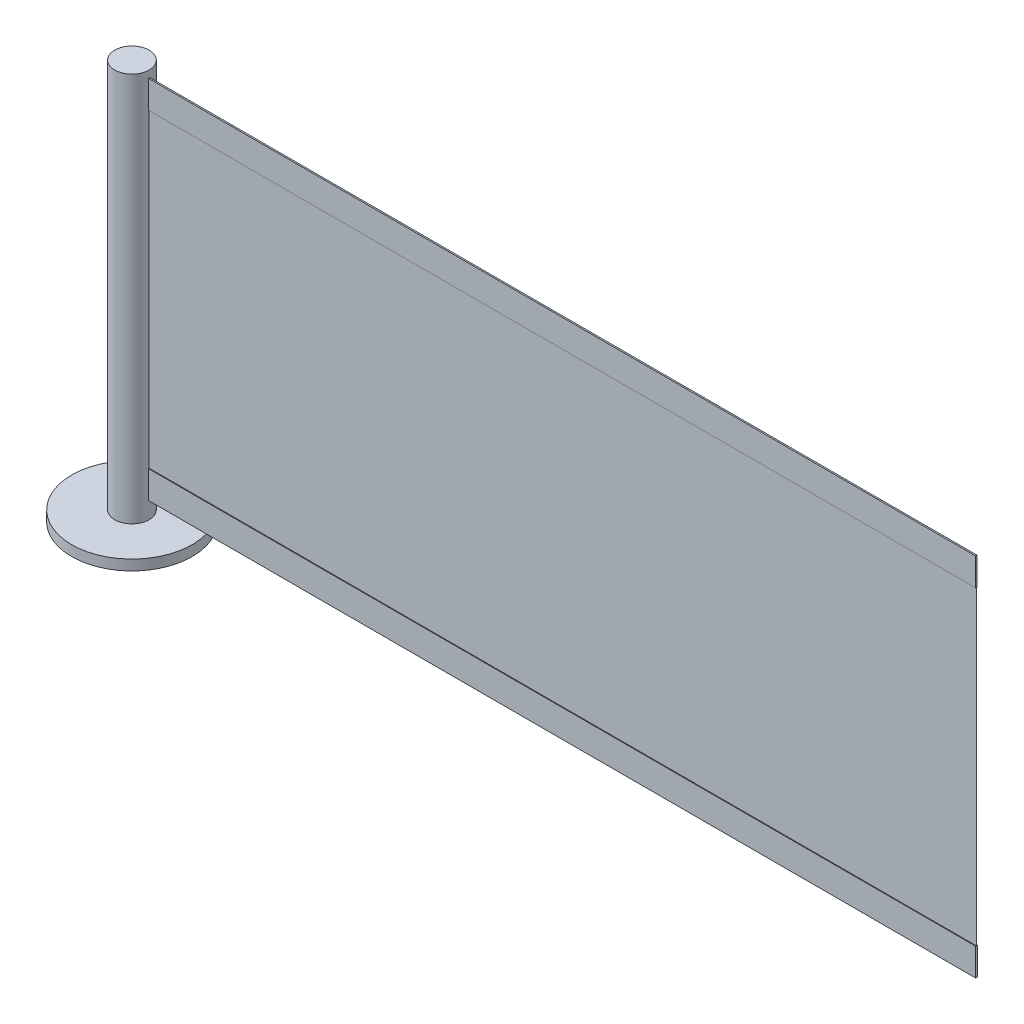
ISO-10303-21;
HEADER;
FILE_DESCRIPTION(('STEP AP214'),'2;1');
FILE_NAME('part.step','',(''),(''),'','','');
FILE_SCHEMA(('AUTOMOTIVE_DESIGN { 1 0 10303 214 1 1 1 1 }'));
ENDSEC;
DATA;
#1=APPLICATION_CONTEXT('core data for automotive mechanical design processes');
#2=APPLICATION_PROTOCOL_DEFINITION('international standard','automotive_design',2000,#1);
#3=PRODUCT_CONTEXT('',#1,'mechanical');
#4=PRODUCT('Part','Part','',(#3));
#5=PRODUCT_RELATED_PRODUCT_CATEGORY('part','',(#4));
#6=PRODUCT_DEFINITION_FORMATION('','',#4);
#7=PRODUCT_DEFINITION_CONTEXT('part definition',#1,'design');
#8=PRODUCT_DEFINITION('design','',#6,#7);
#9=PRODUCT_DEFINITION_SHAPE('','',#8);
#10=(LENGTH_UNIT() NAMED_UNIT(*) SI_UNIT(.MILLI.,.METRE.));
#11=(NAMED_UNIT(*) PLANE_ANGLE_UNIT() SI_UNIT($,.RADIAN.));
#12=(NAMED_UNIT(*) SI_UNIT($,.STERADIAN.) SOLID_ANGLE_UNIT());
#13=UNCERTAINTY_MEASURE_WITH_UNIT(LENGTH_MEASURE(1.E-05),#10,'distance_accuracy_value','');
#14=(GEOMETRIC_REPRESENTATION_CONTEXT(3) GLOBAL_UNCERTAINTY_ASSIGNED_CONTEXT((#13)) GLOBAL_UNIT_ASSIGNED_CONTEXT((#10,
#11,#12)) REPRESENTATION_CONTEXT('',''));
#15=CARTESIAN_POINT('',(0.,0.,0.));
#16=DIRECTION('',(0.,0.,1.));
#17=DIRECTION('',(1.,0.,0.));
#18=AXIS2_PLACEMENT_3D('',#15,#16,#17);
#19=CARTESIAN_POINT('',(0.,30.,0.));
#20=DIRECTION('',(0.,-1.,0.));
#21=DIRECTION('',(0.,0.,-1.));
#22=AXIS2_PLACEMENT_3D('',#19,#20,#21);
#23=CYLINDRICAL_SURFACE('',#22,175.);
#24=CARTESIAN_POINT('',(0.,30.,0.));
#25=DIRECTION('',(0.,1.,0.));
#26=DIRECTION('',(0.,0.,1.));
#27=AXIS2_PLACEMENT_3D('',#24,#25,#26);
#28=CIRCLE('',#27,175.);
#29=CARTESIAN_POINT('',(0.,30.,175.));
#30=VERTEX_POINT('',#29);
#31=EDGE_CURVE('E221',#30,#30,#28,.T.);
#32=ORIENTED_EDGE('',*,*,#31,.F.);
#33=EDGE_LOOP('',(#32));
#34=FACE_BOUND('',#33,.T.);
#35=CARTESIAN_POINT('',(0.,0.,0.));
#36=DIRECTION('',(0.,1.,0.));
#37=DIRECTION('',(0.,0.,1.));
#38=AXIS2_PLACEMENT_3D('',#35,#36,#37);
#39=CIRCLE('',#38,175.);
#40=CARTESIAN_POINT('',(0.,0.,175.));
#41=VERTEX_POINT('',#40);
#42=EDGE_CURVE('E217',#41,#41,#39,.T.);
#43=ORIENTED_EDGE('',*,*,#42,.T.);
#44=EDGE_LOOP('',(#43));
#45=FACE_BOUND('',#44,.T.);
#46=ADVANCED_FACE('F38',(#34,#45),#23,.T.);
#47=CARTESIAN_POINT('',(0.,30.,0.));
#48=DIRECTION('',(0.,1.,0.));
#49=DIRECTION('',(0.,0.,1.));
#50=AXIS2_PLACEMENT_3D('',#47,#48,#49);
#51=PLANE('',#50);
#52=CARTESIAN_POINT('',(0.,30.,0.));
#53=DIRECTION('',(0.,1.,0.));
#54=DIRECTION('',(0.,0.,1.));
#55=AXIS2_PLACEMENT_3D('',#52,#53,#54);
#56=CIRCLE('',#55,50.);
#57=CARTESIAN_POINT('',(0.,30.,50.));
#58=VERTEX_POINT('',#57);
#59=EDGE_CURVE('E218',#58,#58,#56,.T.);
#60=ORIENTED_EDGE('',*,*,#59,.F.);
#61=EDGE_LOOP('',(#60));
#62=FACE_BOUND('',#61,.T.);
#63=ORIENTED_EDGE('',*,*,#31,.T.);
#64=EDGE_LOOP('',(#63));
#65=FACE_BOUND('',#64,.T.);
#66=ADVANCED_FACE('F279',(#62,#65),#51,.T.);
#67=CARTESIAN_POINT('',(0.,0.,0.));
#68=DIRECTION('',(0.,1.,0.));
#69=DIRECTION('',(0.,0.,1.));
#70=AXIS2_PLACEMENT_3D('',#67,#68,#69);
#71=PLANE('',#70);
#72=ORIENTED_EDGE('',*,*,#42,.F.);
#73=EDGE_LOOP('',(#72));
#74=FACE_BOUND('',#73,.T.);
#75=ADVANCED_FACE('F284',(#74),#71,.F.);
#76=CARTESIAN_POINT('',(0.,1140.,0.));
#77=DIRECTION('',(0.,-1.,0.));
#78=DIRECTION('',(0.,0.,-1.));
#79=AXIS2_PLACEMENT_3D('',#76,#77,#78);
#80=CYLINDRICAL_SURFACE('',#79,50.);
#81=DIRECTION('',(0.,-1.,0.));
#82=VECTOR('',#81,1.);
#83=CARTESIAN_POINT('',(49.9389936535584,1140.,2.46919275672328));
#84=LINE('',#83,#82);
#85=CARTESIAN_POINT('',(49.9389936535584,80.0000000000003,2.46919275672322));
#86=VERTEX_POINT('',#85);
#87=CARTESIAN_POINT('',(49.9389936535584,160.,2.46919275672328));
#88=VERTEX_POINT('',#87);
#89=EDGE_CURVE('E11',#86,#88,#84,.F.);
#90=ORIENTED_EDGE('',*,*,#89,.T.);
#91=CARTESIAN_POINT('',(0.,160.,0.));
#92=DIRECTION('',(0.,1.,0.));
#93=DIRECTION('',(-1.,0.,0.));
#94=AXIS2_PLACEMENT_3D('',#91,#92,#93);
#95=CIRCLE('',#94,50.);
#96=CARTESIAN_POINT('',(49.9974999374969,160.,0.499999999999982));
#97=VERTEX_POINT('',#96);
#98=EDGE_CURVE('E180',#88,#97,#95,.T.);
#99=ORIENTED_EDGE('',*,*,#98,.T.);
#100=DIRECTION('',(0.,-1.,0.));
#101=VECTOR('',#100,1.);
#102=CARTESIAN_POINT('',(49.9974999374969,1140.,0.499999999999982));
#103=LINE('',#102,#101);
#104=CARTESIAN_POINT('',(49.9974999374969,1060.,0.499999999999982));
#105=VERTEX_POINT('',#104);
#106=EDGE_CURVE('E215',#97,#105,#103,.F.);
#107=ORIENTED_EDGE('',*,*,#106,.T.);
#108=CARTESIAN_POINT('',(0.,1060.,0.));
#109=DIRECTION('',(0.,-1.,0.));
#110=DIRECTION('',(0.,0.,-1.));
#111=AXIS2_PLACEMENT_3D('',#108,#109,#110);
#112=CIRCLE('',#111,50.);
#113=CARTESIAN_POINT('',(49.9599839871872,1060.,2.));
#114=VERTEX_POINT('',#113);
#115=EDGE_CURVE('E129',#105,#114,#112,.T.);
#116=ORIENTED_EDGE('',*,*,#115,.T.);
#117=DIRECTION('',(0.,-1.,0.));
#118=VECTOR('',#117,1.);
#119=CARTESIAN_POINT('',(49.9599839871872,1140.,2.));
#120=LINE('',#119,#118);
#121=CARTESIAN_POINT('',(49.9599839871872,1140.,2.));
#122=VERTEX_POINT('',#121);
#123=EDGE_CURVE('E121',#114,#122,#120,.F.);
#124=ORIENTED_EDGE('',*,*,#123,.T.);
#125=CARTESIAN_POINT('',(0.,1140.,0.));
#126=DIRECTION('',(0.,1.,0.));
#127=DIRECTION('',(0.,0.,1.));
#128=AXIS2_PLACEMENT_3D('',#125,#126,#127);
#129=CIRCLE('',#128,50.);
#130=CARTESIAN_POINT('',(49.9599839871872,1140.,-2.00000000000002));
#131=VERTEX_POINT('',#130);
#132=EDGE_CURVE('E127',#122,#131,#129,.T.);
#133=ORIENTED_EDGE('',*,*,#132,.T.);
#134=DIRECTION('',(0.,-1.,0.));
#135=VECTOR('',#134,1.);
#136=CARTESIAN_POINT('',(49.9599839871872,1140.,-2.00000000000002));
#137=LINE('',#136,#135);
#138=CARTESIAN_POINT('',(49.9599839871872,1060.,-2.00000000000002));
#139=VERTEX_POINT('',#138);
#140=EDGE_CURVE('E133',#131,#139,#137,.T.);
#141=ORIENTED_EDGE('',*,*,#140,.T.);
#142=CARTESIAN_POINT('',(49.9974999374969,1060.,-0.5));
#143=VERTEX_POINT('',#142);
#144=EDGE_CURVE('E198',#139,#143,#112,.T.);
#145=ORIENTED_EDGE('',*,*,#144,.T.);
#146=DIRECTION('',(0.,-1.,0.));
#147=VECTOR('',#146,1.);
#148=CARTESIAN_POINT('',(49.9974999374969,1140.,-0.5));
#149=LINE('',#148,#147);
#150=CARTESIAN_POINT('',(49.9974999374969,160.,-0.5));
#151=VERTEX_POINT('',#150);
#152=EDGE_CURVE('E211',#143,#151,#149,.T.);
#153=ORIENTED_EDGE('',*,*,#152,.T.);
#154=CARTESIAN_POINT('',(49.9389936535584,160.,-2.46919275672314));
#155=VERTEX_POINT('',#154);
#156=EDGE_CURVE('E177',#151,#155,#95,.T.);
#157=ORIENTED_EDGE('',*,*,#156,.T.);
#158=DIRECTION('',(0.,-1.,0.));
#159=VECTOR('',#158,1.);
#160=CARTESIAN_POINT('',(49.9389936535584,1140.,-2.46919275672314));
#161=LINE('',#160,#159);
#162=CARTESIAN_POINT('',(49.9389936535584,80.0000000000003,-2.46919275672321));
#163=VERTEX_POINT('',#162);
#164=EDGE_CURVE('E45',#155,#163,#161,.T.);
#165=ORIENTED_EDGE('',*,*,#164,.T.);
#166=CARTESIAN_POINT('',(0.,80.0000000000001,0.));
#167=DIRECTION('',(0.,-1.,0.));
#168=DIRECTION('',(0.,0.,-1.));
#169=AXIS2_PLACEMENT_3D('',#166,#167,#168);
#170=CIRCLE('',#169,50.);
#171=EDGE_CURVE('E55',#163,#86,#170,.T.);
#172=ORIENTED_EDGE('',*,*,#171,.T.);
#173=EDGE_LOOP('',(#90,#99,#107,#116,#124,#133,#141,#145,#153,#157,#165,#172));
#174=FACE_BOUND('',#173,.T.);
#175=ORIENTED_EDGE('',*,*,#59,.T.);
#176=EDGE_LOOP('',(#175));
#177=FACE_BOUND('',#176,.T.);
#178=CARTESIAN_POINT('',(0.,1160.,0.));
#179=DIRECTION('',(0.,1.,0.));
#180=DIRECTION('',(0.,0.,1.));
#181=AXIS2_PLACEMENT_3D('',#178,#179,#180);
#182=CIRCLE('',#181,50.);
#183=CARTESIAN_POINT('',(0.,1160.,50.));
#184=VERTEX_POINT('',#183);
#185=EDGE_CURVE('E148',#184,#184,#182,.T.);
#186=ORIENTED_EDGE('',*,*,#185,.F.);
#187=EDGE_LOOP('',(#186));
#188=FACE_BOUND('',#187,.T.);
#189=ADVANCED_FACE('F123',(#174,#177,#188),#80,.T.);
#190=CARTESIAN_POINT('',(0.,1140.,0.));
#191=DIRECTION('',(0.,1.,0.));
#192=DIRECTION('',(0.,0.,1.));
#193=AXIS2_PLACEMENT_3D('',#190,#191,#192);
#194=PLANE('',#193);
#195=ORIENTED_EDGE('',*,*,#132,.F.);
#196=DIRECTION('',(1.,0.,0.));
#197=VECTOR('',#196,1.);
#198=CARTESIAN_POINT('',(0.,1140.,2.));
#199=LINE('',#198,#197);
#200=CARTESIAN_POINT('',(2450.,1140.,2.));
#201=VERTEX_POINT('',#200);
#202=EDGE_CURVE('E137',#122,#201,#199,.T.);
#203=ORIENTED_EDGE('',*,*,#202,.T.);
#204=DIRECTION('',(0.,0.,-1.));
#205=VECTOR('',#204,1.);
#206=CARTESIAN_POINT('',(2450.,1140.,0.4999999999991));
#207=LINE('',#206,#205);
#208=CARTESIAN_POINT('',(2450.,1140.,-2.0000000000009));
#209=VERTEX_POINT('',#208);
#210=EDGE_CURVE('E132',#201,#209,#207,.T.);
#211=ORIENTED_EDGE('',*,*,#210,.T.);
#212=DIRECTION('',(-1.,0.,0.));
#213=VECTOR('',#212,1.);
#214=CARTESIAN_POINT('',(0.,1140.,-2.));
#215=LINE('',#214,#213);
#216=EDGE_CURVE('E143',#209,#131,#215,.T.);
#217=ORIENTED_EDGE('',*,*,#216,.T.);
#218=EDGE_LOOP('',(#195,#203,#211,#217));
#219=FACE_BOUND('',#218,.T.);
#220=ADVANCED_FACE('F146',(#219),#194,.T.);
#221=CARTESIAN_POINT('',(0.,80.0000000000001,0.5));
#222=DIRECTION('',(0.,0.,1.));
#223=DIRECTION('',(1.,0.,0.));
#224=AXIS2_PLACEMENT_3D('',#221,#222,#223);
#225=PLANE('',#224);
#226=DIRECTION('',(-1.,0.,0.));
#227=VECTOR('',#226,1.);
#228=CARTESIAN_POINT('',(0.,160.,0.5));
#229=LINE('',#228,#227);
#230=CARTESIAN_POINT('',(2450.,160.,0.4999999999991));
#231=VERTEX_POINT('',#230);
#232=EDGE_CURVE('E179',#231,#97,#229,.T.);
#233=ORIENTED_EDGE('',*,*,#232,.F.);
#234=DIRECTION('',(0.,1.,0.));
#235=VECTOR('',#234,1.);
#236=CARTESIAN_POINT('',(2450.,80.0000000000001,0.4999999999991));
#237=LINE('',#236,#235);
#238=CARTESIAN_POINT('',(2450.,1060.,0.4999999999991));
#239=VERTEX_POINT('',#238);
#240=EDGE_CURVE('E209',#231,#239,#237,.T.);
#241=ORIENTED_EDGE('',*,*,#240,.T.);
#242=DIRECTION('',(1.,0.,0.));
#243=VECTOR('',#242,1.);
#244=CARTESIAN_POINT('',(0.,1060.,0.5));
#245=LINE('',#244,#243);
#246=EDGE_CURVE('E201',#105,#239,#245,.T.);
#247=ORIENTED_EDGE('',*,*,#246,.F.);
#248=ORIENTED_EDGE('',*,*,#106,.F.);
#249=EDGE_LOOP('',(#233,#241,#247,#248));
#250=FACE_BOUND('',#249,.T.);
#251=ADVANCED_FACE('F246',(#250),#225,.T.);
#252=CARTESIAN_POINT('',(0.,80.0000000000001,-0.5));
#253=DIRECTION('',(0.,0.,-1.));
#254=DIRECTION('',(-1.,0.,0.));
#255=AXIS2_PLACEMENT_3D('',#252,#253,#254);
#256=PLANE('',#255);
#257=DIRECTION('',(1.,0.,0.));
#258=VECTOR('',#257,1.);
#259=CARTESIAN_POINT('',(0.,160.,-0.5));
#260=LINE('',#259,#258);
#261=CARTESIAN_POINT('',(2450.,160.,-0.5));
#262=VERTEX_POINT('',#261);
#263=EDGE_CURVE('E172',#151,#262,#260,.T.);
#264=ORIENTED_EDGE('',*,*,#263,.F.);
#265=ORIENTED_EDGE('',*,*,#152,.F.);
#266=DIRECTION('',(-1.,0.,0.));
#267=VECTOR('',#266,1.);
#268=CARTESIAN_POINT('',(0.,1060.,-0.5));
#269=LINE('',#268,#267);
#270=CARTESIAN_POINT('',(2450.,1060.,-0.5));
#271=VERTEX_POINT('',#270);
#272=EDGE_CURVE('E194',#271,#143,#269,.T.);
#273=ORIENTED_EDGE('',*,*,#272,.F.);
#274=DIRECTION('',(0.,1.,0.));
#275=VECTOR('',#274,1.);
#276=CARTESIAN_POINT('',(2450.,80.0000000000001,-0.5));
#277=LINE('',#276,#275);
#278=EDGE_CURVE('E207',#262,#271,#277,.T.);
#279=ORIENTED_EDGE('',*,*,#278,.F.);
#280=EDGE_LOOP('',(#264,#265,#273,#279));
#281=FACE_BOUND('',#280,.T.);
#282=ADVANCED_FACE('F262',(#281),#256,.T.);
#283=CARTESIAN_POINT('',(2450.,80.0000000000001,0.4999999999991));
#284=DIRECTION('',(1.,0.,0.));
#285=DIRECTION('',(0.,0.,-1.));
#286=AXIS2_PLACEMENT_3D('',#283,#284,#285);
#287=PLANE('',#286);
#288=ORIENTED_EDGE('',*,*,#240,.F.);
#289=DIRECTION('',(0.,0.,1.));
#290=VECTOR('',#289,1.);
#291=CARTESIAN_POINT('',(2450.,160.,2.46919275672322));
#292=LINE('',#291,#290);
#293=CARTESIAN_POINT('',(2450.,160.,2.46919275672322));
#294=VERTEX_POINT('',#293);
#295=EDGE_CURVE('E156',#231,#294,#292,.T.);
#296=ORIENTED_EDGE('',*,*,#295,.T.);
#297=DIRECTION('',(0.,-1.,0.));
#298=VECTOR('',#297,1.);
#299=CARTESIAN_POINT('',(2450.,160.,2.46919275672322));
#300=LINE('',#299,#298);
#301=CARTESIAN_POINT('',(2450.,80.,2.46919275672322));
#302=VERTEX_POINT('',#301);
#303=EDGE_CURVE('E169',#294,#302,#300,.T.);
#304=ORIENTED_EDGE('',*,*,#303,.T.);
#305=DIRECTION('',(0.,0.,-1.));
#306=VECTOR('',#305,1.);
#307=CARTESIAN_POINT('',(2450.,80.0000000000001,0.4999999999991));
#308=LINE('',#307,#306);
#309=CARTESIAN_POINT('',(2450.,80.,-2.46919275672321));
#310=VERTEX_POINT('',#309);
#311=EDGE_CURVE('E205',#302,#310,#308,.T.);
#312=ORIENTED_EDGE('',*,*,#311,.T.);
#313=DIRECTION('',(0.,-1.,0.));
#314=VECTOR('',#313,1.);
#315=CARTESIAN_POINT('',(2450.,160.,-2.4691927567232));
#316=LINE('',#315,#314);
#317=CARTESIAN_POINT('',(2450.,160.,-2.4691927567232));
#318=VERTEX_POINT('',#317);
#319=EDGE_CURVE('E164',#318,#310,#316,.T.);
#320=ORIENTED_EDGE('',*,*,#319,.F.);
#321=EDGE_CURVE('E158',#318,#262,#292,.T.);
#322=ORIENTED_EDGE('',*,*,#321,.T.);
#323=ORIENTED_EDGE('',*,*,#278,.T.);
#324=DIRECTION('',(0.,0.,-1.));
#325=VECTOR('',#324,1.);
#326=CARTESIAN_POINT('',(2450.,1060.,2.));
#327=LINE('',#326,#325);
#328=CARTESIAN_POINT('',(2450.,1060.,-2.0000000000009));
#329=VERTEX_POINT('',#328);
#330=EDGE_CURVE('E142',#271,#329,#327,.T.);
#331=ORIENTED_EDGE('',*,*,#330,.T.);
#332=DIRECTION('',(0.,1.,0.));
#333=VECTOR('',#332,1.);
#334=CARTESIAN_POINT('',(2450.,1060.,-2.0000000000009));
#335=LINE('',#334,#333);
#336=EDGE_CURVE('E191',#329,#209,#335,.T.);
#337=ORIENTED_EDGE('',*,*,#336,.T.);
#338=ORIENTED_EDGE('',*,*,#210,.F.);
#339=DIRECTION('',(0.,1.,0.));
#340=VECTOR('',#339,1.);
#341=CARTESIAN_POINT('',(2450.,1060.,2.));
#342=LINE('',#341,#340);
#343=CARTESIAN_POINT('',(2450.,1060.,2.));
#344=VERTEX_POINT('',#343);
#345=EDGE_CURVE('E140',#344,#201,#342,.T.);
#346=ORIENTED_EDGE('',*,*,#345,.F.);
#347=EDGE_CURVE('E183',#344,#239,#327,.T.);
#348=ORIENTED_EDGE('',*,*,#347,.T.);
#349=EDGE_LOOP('',(#288,#296,#304,#312,#320,#322,#323,#331,#337,#338,#346,#348));
#350=FACE_BOUND('',#349,.T.);
#351=ADVANCED_FACE('F252',(#350),#287,.T.);
#352=CARTESIAN_POINT('',(0.,80.0000000000001,0.));
#353=DIRECTION('',(0.,-1.,0.));
#354=DIRECTION('',(0.,0.,-1.));
#355=AXIS2_PLACEMENT_3D('',#352,#353,#354);
#356=PLANE('',#355);
#357=ORIENTED_EDGE('',*,*,#171,.F.);
#358=DIRECTION('',(1.,0.,0.));
#359=VECTOR('',#358,1.);
#360=CARTESIAN_POINT('',(2450.,80.,-2.46919275672321));
#361=LINE('',#360,#359);
#362=EDGE_CURVE('E151',#163,#310,#361,.T.);
#363=ORIENTED_EDGE('',*,*,#362,.T.);
#364=ORIENTED_EDGE('',*,*,#311,.F.);
#365=DIRECTION('',(-1.,0.,0.));
#366=VECTOR('',#365,1.);
#367=CARTESIAN_POINT('',(2450.,80.,2.46919275672322));
#368=LINE('',#367,#366);
#369=EDGE_CURVE('E157',#302,#86,#368,.T.);
#370=ORIENTED_EDGE('',*,*,#369,.T.);
#371=EDGE_LOOP('',(#357,#363,#364,#370));
#372=FACE_BOUND('',#371,.T.);
#373=ADVANCED_FACE('F234',(#372),#356,.T.);
#374=CARTESIAN_POINT('',(0.,1060.,0.));
#375=DIRECTION('',(0.,-1.,0.));
#376=DIRECTION('',(0.,0.,-1.));
#377=AXIS2_PLACEMENT_3D('',#374,#375,#376);
#378=PLANE('',#377);
#379=ORIENTED_EDGE('',*,*,#144,.F.);
#380=DIRECTION('',(-1.,0.,0.));
#381=VECTOR('',#380,1.);
#382=CARTESIAN_POINT('',(0.,1060.,-2.));
#383=LINE('',#382,#381);
#384=EDGE_CURVE('E186',#329,#139,#383,.T.);
#385=ORIENTED_EDGE('',*,*,#384,.F.);
#386=ORIENTED_EDGE('',*,*,#330,.F.);
#387=ORIENTED_EDGE('',*,*,#272,.T.);
#388=EDGE_LOOP('',(#379,#385,#386,#387));
#389=FACE_BOUND('',#388,.T.);
#390=ADVANCED_FACE('F266',(#389),#378,.T.);
#391=CARTESIAN_POINT('',(0.,1060.,-2.));
#392=DIRECTION('',(0.,0.,-1.));
#393=DIRECTION('',(-1.,0.,0.));
#394=AXIS2_PLACEMENT_3D('',#391,#392,#393);
#395=PLANE('',#394);
#396=ORIENTED_EDGE('',*,*,#140,.F.);
#397=ORIENTED_EDGE('',*,*,#216,.F.);
#398=ORIENTED_EDGE('',*,*,#336,.F.);
#399=ORIENTED_EDGE('',*,*,#384,.T.);
#400=EDGE_LOOP('',(#396,#397,#398,#399));
#401=FACE_BOUND('',#400,.T.);
#402=ADVANCED_FACE('F257',(#401),#395,.T.);
#403=CARTESIAN_POINT('',(0.,1060.,2.));
#404=DIRECTION('',(0.,0.,1.));
#405=DIRECTION('',(1.,0.,0.));
#406=AXIS2_PLACEMENT_3D('',#403,#404,#405);
#407=PLANE('',#406);
#408=ORIENTED_EDGE('',*,*,#123,.F.);
#409=DIRECTION('',(1.,0.,0.));
#410=VECTOR('',#409,1.);
#411=CARTESIAN_POINT('',(0.,1060.,2.));
#412=LINE('',#411,#410);
#413=EDGE_CURVE('E189',#114,#344,#412,.T.);
#414=ORIENTED_EDGE('',*,*,#413,.T.);
#415=ORIENTED_EDGE('',*,*,#345,.T.);
#416=ORIENTED_EDGE('',*,*,#202,.F.);
#417=EDGE_LOOP('',(#408,#414,#415,#416));
#418=FACE_BOUND('',#417,.T.);
#419=ADVANCED_FACE('F138',(#418),#407,.T.);
#420=ORIENTED_EDGE('',*,*,#115,.F.);
#421=ORIENTED_EDGE('',*,*,#246,.T.);
#422=ORIENTED_EDGE('',*,*,#347,.F.);
#423=ORIENTED_EDGE('',*,*,#413,.F.);
#424=EDGE_LOOP('',(#420,#421,#422,#423));
#425=FACE_BOUND('',#424,.T.);
#426=ADVANCED_FACE('F250',(#425),#378,.T.);
#427=CARTESIAN_POINT('',(0.,160.,0.));
#428=DIRECTION('',(0.,1.,0.));
#429=DIRECTION('',(-1.,0.,0.));
#430=AXIS2_PLACEMENT_3D('',#427,#428,#429);
#431=PLANE('',#430);
#432=ORIENTED_EDGE('',*,*,#156,.F.);
#433=ORIENTED_EDGE('',*,*,#263,.T.);
#434=ORIENTED_EDGE('',*,*,#321,.F.);
#435=DIRECTION('',(1.,0.,0.));
#436=VECTOR('',#435,1.);
#437=CARTESIAN_POINT('',(2450.,160.,-2.4691927567232));
#438=LINE('',#437,#436);
#439=EDGE_CURVE('E154',#155,#318,#438,.T.);
#440=ORIENTED_EDGE('',*,*,#439,.F.);
#441=EDGE_LOOP('',(#432,#433,#434,#440));
#442=FACE_BOUND('',#441,.T.);
#443=ADVANCED_FACE('F265',(#442),#431,.T.);
#444=CARTESIAN_POINT('',(2450.,160.,-2.4691927567232));
#445=DIRECTION('',(0.,0.,-1.));
#446=DIRECTION('',(0.,1.,0.));
#447=AXIS2_PLACEMENT_3D('',#444,#445,#446);
#448=PLANE('',#447);
#449=ORIENTED_EDGE('',*,*,#164,.F.);
#450=ORIENTED_EDGE('',*,*,#439,.T.);
#451=ORIENTED_EDGE('',*,*,#319,.T.);
#452=ORIENTED_EDGE('',*,*,#362,.F.);
#453=EDGE_LOOP('',(#449,#450,#451,#452));
#454=FACE_BOUND('',#453,.T.);
#455=ADVANCED_FACE('F231',(#454),#448,.T.);
#456=CARTESIAN_POINT('',(2450.,160.,2.46919275672322));
#457=DIRECTION('',(0.,0.,1.));
#458=DIRECTION('',(0.,-1.,0.));
#459=AXIS2_PLACEMENT_3D('',#456,#457,#458);
#460=PLANE('',#459);
#461=ORIENTED_EDGE('',*,*,#89,.F.);
#462=ORIENTED_EDGE('',*,*,#369,.F.);
#463=ORIENTED_EDGE('',*,*,#303,.F.);
#464=DIRECTION('',(-1.,0.,0.));
#465=VECTOR('',#464,1.);
#466=CARTESIAN_POINT('',(2450.,160.,2.46919275672322));
#467=LINE('',#466,#465);
#468=EDGE_CURVE('E161',#294,#88,#467,.T.);
#469=ORIENTED_EDGE('',*,*,#468,.T.);
#470=EDGE_LOOP('',(#461,#462,#463,#469));
#471=FACE_BOUND('',#470,.T.);
#472=ADVANCED_FACE('F238',(#471),#460,.T.);
#473=ORIENTED_EDGE('',*,*,#98,.F.);
#474=ORIENTED_EDGE('',*,*,#468,.F.);
#475=ORIENTED_EDGE('',*,*,#295,.F.);
#476=ORIENTED_EDGE('',*,*,#232,.T.);
#477=EDGE_LOOP('',(#473,#474,#475,#476));
#478=FACE_BOUND('',#477,.T.);
#479=ADVANCED_FACE('F242',(#478),#431,.T.);
#480=CARTESIAN_POINT('',(0.,1160.,0.));
#481=DIRECTION('',(0.,1.,0.));
#482=DIRECTION('',(0.,0.,1.));
#483=AXIS2_PLACEMENT_3D('',#480,#481,#482);
#484=PLANE('',#483);
#485=ORIENTED_EDGE('',*,*,#185,.T.);
#486=EDGE_LOOP('',(#485));
#487=FACE_BOUND('',#486,.T.);
#488=ADVANCED_FACE('F338',(#487),#484,.T.);
#489=CLOSED_SHELL('',(#46,#66,#75,#189,#220,#251,#282,#351,#373,#390,#402,#419,#426,#443,#455,
#472,#479,#488));
#490=MANIFOLD_SOLID_BREP('B2',#489);
#491=ADVANCED_BREP_SHAPE_REPRESENTATION('',(#18,#490),#14);
#492=SHAPE_DEFINITION_REPRESENTATION(#9,#491);
ENDSEC;
END-ISO-10303-21;
